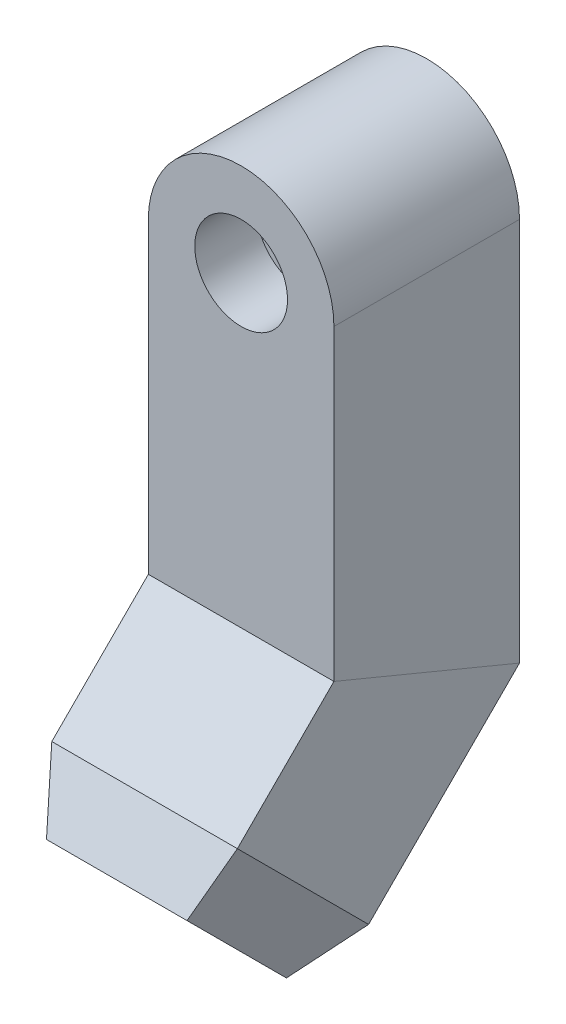
ISO-10303-21;
HEADER;
FILE_DESCRIPTION(('STEP AP214'),'2;1');
FILE_NAME('part.step','',(''),(''),'','','');
FILE_SCHEMA(('AUTOMOTIVE_DESIGN { 1 0 10303 214 1 1 1 1 }'));
ENDSEC;
DATA;
#1=APPLICATION_CONTEXT('core data for automotive mechanical design processes');
#2=APPLICATION_PROTOCOL_DEFINITION('international standard','automotive_design',2000,#1);
#3=PRODUCT_CONTEXT('',#1,'mechanical');
#4=PRODUCT('Part','Part','',(#3));
#5=PRODUCT_RELATED_PRODUCT_CATEGORY('part','',(#4));
#6=PRODUCT_DEFINITION_FORMATION('','',#4);
#7=PRODUCT_DEFINITION_CONTEXT('part definition',#1,'design');
#8=PRODUCT_DEFINITION('design','',#6,#7);
#9=PRODUCT_DEFINITION_SHAPE('','',#8);
#10=(LENGTH_UNIT() NAMED_UNIT(*) SI_UNIT(.MILLI.,.METRE.));
#11=(NAMED_UNIT(*) PLANE_ANGLE_UNIT() SI_UNIT($,.RADIAN.));
#12=(NAMED_UNIT(*) SI_UNIT($,.STERADIAN.) SOLID_ANGLE_UNIT());
#13=UNCERTAINTY_MEASURE_WITH_UNIT(LENGTH_MEASURE(1.E-05),#10,'distance_accuracy_value','');
#14=(GEOMETRIC_REPRESENTATION_CONTEXT(3) GLOBAL_UNCERTAINTY_ASSIGNED_CONTEXT((#13)) GLOBAL_UNIT_ASSIGNED_CONTEXT((#10,
#11,#12)) REPRESENTATION_CONTEXT('',''));
#15=CARTESIAN_POINT('',(0.,0.,0.));
#16=DIRECTION('',(0.,0.,1.));
#17=DIRECTION('',(1.,0.,0.));
#18=AXIS2_PLACEMENT_3D('',#15,#16,#17);
#19=CARTESIAN_POINT('',(19.05,45.0786722599583,7.26209610324912));
#20=DIRECTION('',(-1.,0.,0.));
#21=DIRECTION('',(0.,0.,1.));
#22=AXIS2_PLACEMENT_3D('',#19,#20,#21);
#23=PLANE('',#22);
#24=DIRECTION('',(0.,0.382683432365091,0.923879532511287));
#25=VECTOR('',#24,1.);
#26=CARTESIAN_POINT('',(19.05,42.5318762324136,41.3600079491902));
#27=LINE('',#26,#25);
#28=CARTESIAN_POINT('',(19.05,17.5092316367925,-19.05));
#29=VERTEX_POINT('',#28);
#30=CARTESIAN_POINT('',(19.05,33.2907683632075,19.05));
#31=VERTEX_POINT('',#30);
#32=EDGE_CURVE('E113',#29,#31,#27,.T.);
#33=ORIENTED_EDGE('',*,*,#32,.T.);
#34=DIRECTION('',(0.,-0.707106781186546,0.707106781186549));
#35=VECTOR('',#34,1.);
#36=CARTESIAN_POINT('',(19.05,45.0786722599583,7.26209610324912));
#37=LINE('',#36,#35);
#38=CARTESIAN_POINT('',(19.05,13.4703841816038,38.8703841816038));
#39=VERTEX_POINT('',#38);
#40=EDGE_CURVE('E49',#31,#39,#37,.T.);
#41=ORIENTED_EDGE('',*,*,#40,.T.);
#42=DIRECTION('',(0.,-0.707106781186549,-0.707106781186546));
#43=VECTOR('',#42,1.);
#44=CARTESIAN_POINT('',(19.05,13.4703841816038,38.8703841816038));
#45=LINE('',#44,#43);
#46=CARTESIAN_POINT('',(19.05,-13.4703841816038,11.9296158183964));
#47=VERTEX_POINT('',#46);
#48=EDGE_CURVE('E203',#39,#47,#45,.T.);
#49=ORIENTED_EDGE('',*,*,#48,.T.);
#50=DIRECTION('',(0.,-0.707106781186546,0.707106781186549));
#51=VECTOR('',#50,1.);
#52=CARTESIAN_POINT('',(19.05,18.1379038967508,-19.6786722599583));
#53=LINE('',#52,#51);
#54=EDGE_CURVE('E214',#29,#47,#53,.T.);
#55=ORIENTED_EDGE('',*,*,#54,.F.);
#56=EDGE_LOOP('',(#33,#41,#49,#55));
#57=FACE_BOUND('',#56,.T.);
#58=ADVANCED_FACE('F45',(#57),#23,.F.);
#59=CARTESIAN_POINT('',(-19.05,18.1379038967508,-19.6786722599583));
#60=DIRECTION('',(0.,0.707106781186549,0.707106781186546));
#61=DIRECTION('',(0.,-0.707106781186546,0.707106781186549));
#62=AXIS2_PLACEMENT_3D('',#59,#60,#61);
#63=PLANE('',#62);
#64=DIRECTION('',(1.,0.,0.));
#65=VECTOR('',#64,1.);
#66=CARTESIAN_POINT('',(-19.05,17.5092316367925,-19.05));
#67=LINE('',#66,#65);
#68=CARTESIAN_POINT('',(-19.05,17.5092316367925,-19.05));
#69=VERTEX_POINT('',#68);
#70=EDGE_CURVE('E11',#69,#29,#67,.T.);
#71=ORIENTED_EDGE('',*,*,#70,.T.);
#72=ORIENTED_EDGE('',*,*,#54,.T.);
#73=DIRECTION('',(-1.,0.,0.));
#74=VECTOR('',#73,1.);
#75=CARTESIAN_POINT('',(-19.05,-13.4703841816038,11.9296158183964));
#76=LINE('',#75,#74);
#77=CARTESIAN_POINT('',(-19.05,-13.4703841816038,11.9296158183964));
#78=VERTEX_POINT('',#77);
#79=EDGE_CURVE('E199',#47,#78,#76,.T.);
#80=ORIENTED_EDGE('',*,*,#79,.T.);
#81=DIRECTION('',(0.,-0.707106781186546,0.707106781186549));
#82=VECTOR('',#81,1.);
#83=CARTESIAN_POINT('',(-19.05,18.1379038967508,-19.6786722599583));
#84=LINE('',#83,#82);
#85=EDGE_CURVE('E211',#69,#78,#84,.T.);
#86=ORIENTED_EDGE('',*,*,#85,.F.);
#87=EDGE_LOOP('',(#71,#72,#80,#86));
#88=FACE_BOUND('',#87,.T.);
#89=ADVANCED_FACE('F236',(#88),#63,.F.);
#90=CARTESIAN_POINT('',(-19.05,45.0786722599583,7.26209610324912));
#91=DIRECTION('',(1.,0.,0.));
#92=DIRECTION('',(0.,0.,-1.));
#93=AXIS2_PLACEMENT_3D('',#90,#91,#92);
#94=PLANE('',#93);
#95=DIRECTION('',(0.,-0.382683432365091,-0.923879532511287));
#96=VECTOR('',#95,1.);
#97=CARTESIAN_POINT('',(-19.05,42.5318762324136,41.3600079491902));
#98=LINE('',#97,#96);
#99=CARTESIAN_POINT('',(-19.05,33.2907683632075,19.05));
#100=VERTEX_POINT('',#99);
#101=EDGE_CURVE('E56',#100,#69,#98,.T.);
#102=ORIENTED_EDGE('',*,*,#101,.T.);
#103=ORIENTED_EDGE('',*,*,#85,.T.);
#104=DIRECTION('',(0.,0.707106781186549,0.707106781186546));
#105=VECTOR('',#104,1.);
#106=CARTESIAN_POINT('',(-19.05,13.4703841816038,38.8703841816038));
#107=LINE('',#106,#105);
#108=CARTESIAN_POINT('',(-19.05,13.4703841816038,38.8703841816038));
#109=VERTEX_POINT('',#108);
#110=EDGE_CURVE('E195',#78,#109,#107,.T.);
#111=ORIENTED_EDGE('',*,*,#110,.T.);
#112=DIRECTION('',(0.,-0.707106781186546,0.707106781186549));
#113=VECTOR('',#112,1.);
#114=CARTESIAN_POINT('',(-19.05,45.0786722599583,7.26209610324912));
#115=LINE('',#114,#113);
#116=EDGE_CURVE('E207',#100,#109,#115,.T.);
#117=ORIENTED_EDGE('',*,*,#116,.F.);
#118=EDGE_LOOP('',(#102,#103,#111,#117));
#119=FACE_BOUND('',#118,.T.);
#120=ADVANCED_FACE('F235',(#119),#94,.F.);
#121=CARTESIAN_POINT('',(-19.05,45.0786722599583,7.26209610324912));
#122=DIRECTION('',(0.,-0.707106781186549,-0.707106781186546));
#123=DIRECTION('',(0.,0.707106781186546,-0.707106781186549));
#124=AXIS2_PLACEMENT_3D('',#121,#122,#123);
#125=PLANE('',#124);
#126=DIRECTION('',(-1.,0.,0.));
#127=VECTOR('',#126,1.);
#128=CARTESIAN_POINT('',(-19.05,33.2907683632075,19.05));
#129=LINE('',#128,#127);
#130=EDGE_CURVE('E176',#31,#100,#129,.T.);
#131=ORIENTED_EDGE('',*,*,#130,.T.);
#132=ORIENTED_EDGE('',*,*,#116,.T.);
#133=DIRECTION('',(1.,0.,0.));
#134=VECTOR('',#133,1.);
#135=CARTESIAN_POINT('',(-19.05,13.4703841816038,38.8703841816038));
#136=LINE('',#135,#134);
#137=EDGE_CURVE('E148',#109,#39,#136,.T.);
#138=ORIENTED_EDGE('',*,*,#137,.T.);
#139=ORIENTED_EDGE('',*,*,#40,.F.);
#140=EDGE_LOOP('',(#131,#132,#138,#139));
#141=FACE_BOUND('',#140,.T.);
#142=ADVANCED_FACE('F47',(#141),#125,.F.);
#143=CARTESIAN_POINT('',(-19.05,96.393,19.05));
#144=DIRECTION('',(0.,0.,-1.));
#145=DIRECTION('',(0.,1.,0.));
#146=AXIS2_PLACEMENT_3D('',#143,#144,#145);
#147=PLANE('',#146);
#148=CARTESIAN_POINT('',(0.,96.393,19.05));
#149=DIRECTION('',(0.,0.,1.));
#150=DIRECTION('',(1.,0.,0.));
#151=AXIS2_PLACEMENT_3D('',#148,#149,#150);
#152=CIRCLE('',#151,9.525);
#153=CARTESIAN_POINT('',(9.525,96.393,19.05));
#154=VERTEX_POINT('',#153);
#155=EDGE_CURVE('E141',#154,#154,#152,.T.);
#156=ORIENTED_EDGE('',*,*,#155,.F.);
#157=EDGE_LOOP('',(#156));
#158=FACE_BOUND('',#157,.T.);
#159=DIRECTION('',(0.,-1.,0.));
#160=VECTOR('',#159,1.);
#161=CARTESIAN_POINT('',(19.05,96.393,19.05));
#162=LINE('',#161,#160);
#163=CARTESIAN_POINT('',(19.05,96.393,19.05));
#164=VERTEX_POINT('',#163);
#165=EDGE_CURVE('E118',#164,#31,#162,.T.);
#166=ORIENTED_EDGE('',*,*,#165,.F.);
#167=CARTESIAN_POINT('',(0.,96.393,19.05));
#168=DIRECTION('',(0.,0.,-1.));
#169=DIRECTION('',(0.,1.,0.));
#170=AXIS2_PLACEMENT_3D('',#167,#168,#169);
#171=CIRCLE('',#170,19.05);
#172=CARTESIAN_POINT('',(-19.05,96.393,19.05));
#173=VERTEX_POINT('',#172);
#174=EDGE_CURVE('E127',#164,#173,#171,.F.);
#175=ORIENTED_EDGE('',*,*,#174,.T.);
#176=DIRECTION('',(0.,-1.,0.));
#177=VECTOR('',#176,1.);
#178=CARTESIAN_POINT('',(-19.05,96.393,19.05));
#179=LINE('',#178,#177);
#180=EDGE_CURVE('E184',#173,#100,#179,.T.);
#181=ORIENTED_EDGE('',*,*,#180,.T.);
#182=ORIENTED_EDGE('',*,*,#130,.F.);
#183=EDGE_LOOP('',(#166,#175,#181,#182));
#184=FACE_BOUND('',#183,.T.);
#185=ADVANCED_FACE('F265',(#158,#184),#147,.F.);
#186=CARTESIAN_POINT('',(-19.05,96.393,19.05));
#187=DIRECTION('',(1.,0.,0.));
#188=DIRECTION('',(0.,0.,-1.));
#189=AXIS2_PLACEMENT_3D('',#186,#187,#188);
#190=PLANE('',#189);
#191=ORIENTED_EDGE('',*,*,#180,.F.);
#192=DIRECTION('',(0.,0.,1.));
#193=VECTOR('',#192,1.);
#194=CARTESIAN_POINT('',(-19.05,96.393,19.05));
#195=LINE('',#194,#193);
#196=CARTESIAN_POINT('',(-19.05,96.393,-19.05));
#197=VERTEX_POINT('',#196);
#198=EDGE_CURVE('E129',#197,#173,#195,.T.);
#199=ORIENTED_EDGE('',*,*,#198,.F.);
#200=DIRECTION('',(0.,-1.,0.));
#201=VECTOR('',#200,1.);
#202=CARTESIAN_POINT('',(-19.05,96.393,-19.05));
#203=LINE('',#202,#201);
#204=EDGE_CURVE('E117',#197,#69,#203,.T.);
#205=ORIENTED_EDGE('',*,*,#204,.T.);
#206=ORIENTED_EDGE('',*,*,#101,.F.);
#207=EDGE_LOOP('',(#191,#199,#205,#206));
#208=FACE_BOUND('',#207,.T.);
#209=ADVANCED_FACE('F260',(#208),#190,.F.);
#210=CARTESIAN_POINT('',(-19.05,96.393,-19.05));
#211=DIRECTION('',(0.,0.,1.));
#212=DIRECTION('',(0.,-1.,0.));
#213=AXIS2_PLACEMENT_3D('',#210,#211,#212);
#214=PLANE('',#213);
#215=ORIENTED_EDGE('',*,*,#204,.F.);
#216=CARTESIAN_POINT('',(0.,96.393,-19.05));
#217=DIRECTION('',(0.,0.,-1.));
#218=DIRECTION('',(0.,1.,0.));
#219=AXIS2_PLACEMENT_3D('',#216,#217,#218);
#220=CIRCLE('',#219,19.05);
#221=CARTESIAN_POINT('',(19.05,96.393,-19.05));
#222=VERTEX_POINT('',#221);
#223=EDGE_CURVE('E125',#197,#222,#220,.T.);
#224=ORIENTED_EDGE('',*,*,#223,.T.);
#225=DIRECTION('',(0.,-1.,0.));
#226=VECTOR('',#225,1.);
#227=CARTESIAN_POINT('',(19.05,96.393,-19.05));
#228=LINE('',#227,#226);
#229=EDGE_CURVE('E106',#222,#29,#228,.T.);
#230=ORIENTED_EDGE('',*,*,#229,.T.);
#231=ORIENTED_EDGE('',*,*,#70,.F.);
#232=EDGE_LOOP('',(#215,#224,#230,#231));
#233=FACE_BOUND('',#232,.T.);
#234=ADVANCED_FACE('F131',(#233),#214,.F.);
#235=CARTESIAN_POINT('',(19.05,96.393,19.05));
#236=DIRECTION('',(-1.,0.,0.));
#237=DIRECTION('',(0.,0.,1.));
#238=AXIS2_PLACEMENT_3D('',#235,#236,#237);
#239=PLANE('',#238);
#240=ORIENTED_EDGE('',*,*,#229,.F.);
#241=DIRECTION('',(0.,0.,-1.));
#242=VECTOR('',#241,1.);
#243=CARTESIAN_POINT('',(19.05,96.393,19.05));
#244=LINE('',#243,#242);
#245=EDGE_CURVE('E110',#164,#222,#244,.T.);
#246=ORIENTED_EDGE('',*,*,#245,.F.);
#247=ORIENTED_EDGE('',*,*,#165,.T.);
#248=ORIENTED_EDGE('',*,*,#32,.F.);
#249=EDGE_LOOP('',(#240,#246,#247,#248));
#250=FACE_BOUND('',#249,.T.);
#251=ADVANCED_FACE('F108',(#250),#239,.F.);
#252=CARTESIAN_POINT('',(-19.05,-13.4703841816038,11.9296158183964));
#253=DIRECTION('',(0.,-0.906307787036651,-0.422618261740697));
#254=DIRECTION('',(0.,0.422618261740697,-0.906307787036651));
#255=AXIS2_PLACEMENT_3D('',#252,#253,#254);
#256=PLANE('',#255);
#257=ORIENTED_EDGE('',*,*,#79,.F.);
#258=DIRECTION('',(0.323615577118185,0.399876601840004,-0.857538139995741));
#259=VECTOR('',#258,1.);
#260=CARTESIAN_POINT('',(19.05,-13.4703841816038,11.9296158183964));
#261=LINE('',#260,#259);
#262=CARTESIAN_POINT('',(14.4275780248192,-19.1820943785168,24.1784178636216));
#263=VERTEX_POINT('',#262);
#264=EDGE_CURVE('E145',#263,#47,#261,.T.);
#265=ORIENTED_EDGE('',*,*,#264,.F.);
#266=DIRECTION('',(-1.,0.,0.));
#267=VECTOR('',#266,1.);
#268=CARTESIAN_POINT('',(-19.05,-19.1820943785168,24.1784178636216));
#269=LINE('',#268,#267);
#270=CARTESIAN_POINT('',(-14.4275780248192,-19.1820943785168,24.1784178636216));
#271=VERTEX_POINT('',#270);
#272=EDGE_CURVE('E138',#271,#263,#269,.F.);
#273=ORIENTED_EDGE('',*,*,#272,.F.);
#274=DIRECTION('',(-0.323615577118185,0.399876601840004,-0.857538139995741));
#275=VECTOR('',#274,1.);
#276=CARTESIAN_POINT('',(-19.05,-13.4703841816038,11.9296158183964));
#277=LINE('',#276,#275);
#278=EDGE_CURVE('E150',#271,#78,#277,.T.);
#279=ORIENTED_EDGE('',*,*,#278,.T.);
#280=EDGE_LOOP('',(#257,#265,#273,#279));
#281=FACE_BOUND('',#280,.T.);
#282=ADVANCED_FACE('F240',(#281),#256,.T.);
#283=CARTESIAN_POINT('',(19.05,-13.4703841816038,11.9296158183964));
#284=DIRECTION('',(0.939692620785908,-0.241844762647975,0.241844762647976));
#285=DIRECTION('',(0.249243569363955,0.,-0.968440830991091));
#286=AXIS2_PLACEMENT_3D('',#283,#284,#285);
#287=PLANE('',#286);
#288=ORIENTED_EDGE('',*,*,#48,.F.);
#289=DIRECTION('',(0.323615577118185,0.857538139995739,-0.399876601840008));
#290=VECTOR('',#289,1.);
#291=CARTESIAN_POINT('',(19.05,13.4703841816038,38.8703841816038));
#292=LINE('',#291,#290);
#293=CARTESIAN_POINT('',(14.4275780248192,1.22158213637858,44.5820943785169));
#294=VERTEX_POINT('',#293);
#295=EDGE_CURVE('E149',#294,#39,#292,.T.);
#296=ORIENTED_EDGE('',*,*,#295,.F.);
#297=DIRECTION('',(0.,-0.707106781186549,-0.707106781186546));
#298=VECTOR('',#297,1.);
#299=CARTESIAN_POINT('',(14.4275780248192,-22.4506403026729,20.9098719394655));
#300=LINE('',#299,#298);
#301=EDGE_CURVE('E165',#263,#294,#300,.F.);
#302=ORIENTED_EDGE('',*,*,#301,.F.);
#303=ORIENTED_EDGE('',*,*,#264,.T.);
#304=EDGE_LOOP('',(#288,#296,#302,#303));
#305=FACE_BOUND('',#304,.T.);
#306=ADVANCED_FACE('F245',(#305),#287,.T.);
#307=CARTESIAN_POINT('',(19.05,13.4703841816038,38.8703841816038));
#308=DIRECTION('',(0.,0.4226182617407,0.906307787036649));
#309=DIRECTION('',(0.,-0.90630778703665,0.4226182617407));
#310=AXIS2_PLACEMENT_3D('',#307,#308,#309);
#311=PLANE('',#310);
#312=ORIENTED_EDGE('',*,*,#137,.F.);
#313=DIRECTION('',(-0.323615577118185,0.857538139995739,-0.399876601840008));
#314=VECTOR('',#313,1.);
#315=CARTESIAN_POINT('',(-19.05,13.4703841816038,38.8703841816038));
#316=LINE('',#315,#314);
#317=CARTESIAN_POINT('',(-14.4275780248192,1.22158213637858,44.5820943785169));
#318=VERTEX_POINT('',#317);
#319=EDGE_CURVE('E154',#318,#109,#316,.T.);
#320=ORIENTED_EDGE('',*,*,#319,.F.);
#321=DIRECTION('',(1.,0.,0.));
#322=VECTOR('',#321,1.);
#323=CARTESIAN_POINT('',(19.05,1.22158213637857,44.5820943785169));
#324=LINE('',#323,#322);
#325=EDGE_CURVE('E168',#294,#318,#324,.F.);
#326=ORIENTED_EDGE('',*,*,#325,.F.);
#327=ORIENTED_EDGE('',*,*,#295,.T.);
#328=EDGE_LOOP('',(#312,#320,#326,#327));
#329=FACE_BOUND('',#328,.T.);
#330=ADVANCED_FACE('F227',(#329),#311,.T.);
#331=CARTESIAN_POINT('',(-19.05,13.4703841816038,38.8703841816038));
#332=DIRECTION('',(-0.939692620785908,-0.241844762647975,0.241844762647976));
#333=DIRECTION('',(0.249243569363955,0.,0.968440830991091));
#334=AXIS2_PLACEMENT_3D('',#331,#332,#333);
#335=PLANE('',#334);
#336=ORIENTED_EDGE('',*,*,#110,.F.);
#337=ORIENTED_EDGE('',*,*,#278,.F.);
#338=DIRECTION('',(0.,0.707106781186549,0.707106781186546));
#339=VECTOR('',#338,1.);
#340=CARTESIAN_POINT('',(-14.4275780248192,4.49012806053463,47.850640302673));
#341=LINE('',#340,#339);
#342=EDGE_CURVE('E155',#318,#271,#341,.F.);
#343=ORIENTED_EDGE('',*,*,#342,.F.);
#344=ORIENTED_EDGE('',*,*,#319,.T.);
#345=EDGE_LOOP('',(#336,#337,#343,#344));
#346=FACE_BOUND('',#345,.T.);
#347=ADVANCED_FACE('F232',(#346),#335,.T.);
#348=CARTESIAN_POINT('',(0.,-21.6802561210692,21.6802561210693));
#349=DIRECTION('',(0.,-0.707106781186546,0.707106781186549));
#350=DIRECTION('',(0.,-0.707106781186549,-0.707106781186546));
#351=AXIS2_PLACEMENT_3D('',#348,#349,#350);
#352=PLANE('',#351);
#353=CARTESIAN_POINT('',(0.,-8.98025612106913,34.3802561210692));
#354=DIRECTION('',(0.,-0.707106781186546,0.707106781186549));
#355=DIRECTION('',(0.,-0.707106781186549,-0.707106781186546));
#356=AXIS2_PLACEMENT_3D('',#353,#354,#355);
#357=CIRCLE('',#356,9.525);
#358=CARTESIAN_POINT('',(0.,-15.715448211871,27.6450640302674));
#359=VERTEX_POINT('',#358);
#360=EDGE_CURVE('E386',#359,#359,#357,.T.);
#361=ORIENTED_EDGE('',*,*,#360,.F.);
#362=EDGE_LOOP('',(#361));
#363=FACE_BOUND('',#362,.T.);
#364=ORIENTED_EDGE('',*,*,#272,.T.);
#365=ORIENTED_EDGE('',*,*,#301,.T.);
#366=ORIENTED_EDGE('',*,*,#325,.T.);
#367=ORIENTED_EDGE('',*,*,#342,.T.);
#368=EDGE_LOOP('',(#364,#365,#366,#367));
#369=FACE_BOUND('',#368,.T.);
#370=ADVANCED_FACE('F243',(#363,#369),#352,.T.);
#371=CARTESIAN_POINT('',(0.,96.393,61.647094971371));
#372=DIRECTION('',(0.,0.,-1.));
#373=DIRECTION('',(0.,1.,0.));
#374=AXIS2_PLACEMENT_3D('',#371,#372,#373);
#375=CYLINDRICAL_SURFACE('',#374,19.05);
#376=ORIENTED_EDGE('',*,*,#174,.F.);
#377=ORIENTED_EDGE('',*,*,#245,.T.);
#378=ORIENTED_EDGE('',*,*,#223,.F.);
#379=ORIENTED_EDGE('',*,*,#198,.T.);
#380=EDGE_LOOP('',(#376,#377,#378,#379));
#381=FACE_BOUND('',#380,.T.);
#382=ADVANCED_FACE('F123',(#381),#375,.T.);
#383=CARTESIAN_POINT('',(0.,96.393,6.34999999999999));
#384=DIRECTION('',(0.,0.,1.));
#385=DIRECTION('',(1.,0.,0.));
#386=AXIS2_PLACEMENT_3D('',#383,#384,#385);
#387=CYLINDRICAL_SURFACE('',#386,9.525);
#388=CARTESIAN_POINT('',(0.,96.393,6.34999999999999));
#389=DIRECTION('',(0.,0.,1.));
#390=DIRECTION('',(1.,0.,0.));
#391=AXIS2_PLACEMENT_3D('',#388,#389,#390);
#392=CIRCLE('',#391,9.525);
#393=CARTESIAN_POINT('',(9.525,96.393,6.34999999999999));
#394=VERTEX_POINT('',#393);
#395=EDGE_CURVE('E134',#394,#394,#392,.T.);
#396=ORIENTED_EDGE('',*,*,#395,.F.);
#397=EDGE_LOOP('',(#396));
#398=FACE_BOUND('',#397,.T.);
#399=ORIENTED_EDGE('',*,*,#155,.T.);
#400=EDGE_LOOP('',(#399));
#401=FACE_BOUND('',#400,.T.);
#402=ADVANCED_FACE('F343',(#398,#401),#387,.F.);
#403=CARTESIAN_POINT('',(0.,96.393,6.34999999999999));
#404=DIRECTION('',(0.,0.,1.));
#405=DIRECTION('',(1.,0.,0.));
#406=AXIS2_PLACEMENT_3D('',#403,#404,#405);
#407=PLANE('',#406);
#408=ORIENTED_EDGE('',*,*,#395,.T.);
#409=EDGE_LOOP('',(#408));
#410=FACE_BOUND('',#409,.T.);
#411=ADVANCED_FACE('F351',(#410),#407,.T.);
#412=CARTESIAN_POINT('',(0.,0.,25.4000000000001));
#413=DIRECTION('',(0.,-0.707106781186546,0.707106781186549));
#414=DIRECTION('',(0.,-0.707106781186549,-0.707106781186546));
#415=AXIS2_PLACEMENT_3D('',#412,#413,#414);
#416=CYLINDRICAL_SURFACE('',#415,9.525);
#417=CARTESIAN_POINT('',(0.,0.,25.4000000000001));
#418=DIRECTION('',(0.,-0.707106781186546,0.707106781186549));
#419=DIRECTION('',(0.,-0.707106781186549,-0.707106781186546));
#420=AXIS2_PLACEMENT_3D('',#417,#418,#419);
#421=CIRCLE('',#420,9.525);
#422=CARTESIAN_POINT('',(0.,-6.73519209080187,18.6648079091982));
#423=VERTEX_POINT('',#422);
#424=EDGE_CURVE('E384',#423,#423,#421,.T.);
#425=ORIENTED_EDGE('',*,*,#424,.F.);
#426=EDGE_LOOP('',(#425));
#427=FACE_BOUND('',#426,.T.);
#428=ORIENTED_EDGE('',*,*,#360,.T.);
#429=EDGE_LOOP('',(#428));
#430=FACE_BOUND('',#429,.T.);
#431=ADVANCED_FACE('F360',(#427,#430),#416,.F.);
#432=CARTESIAN_POINT('',(0.,0.,25.4000000000001));
#433=DIRECTION('',(0.,-0.707106781186546,0.707106781186549));
#434=DIRECTION('',(0.,-0.707106781186549,-0.707106781186546));
#435=AXIS2_PLACEMENT_3D('',#432,#433,#434);
#436=PLANE('',#435);
#437=ORIENTED_EDGE('',*,*,#424,.T.);
#438=EDGE_LOOP('',(#437));
#439=FACE_BOUND('',#438,.T.);
#440=ADVANCED_FACE('F369',(#439),#436,.T.);
#441=CLOSED_SHELL('',(#58,#89,#120,#142,#185,#209,#234,#251,#282,#306,#330,#347,#370,#382,#402,
#411,#431,#440));
#442=MANIFOLD_SOLID_BREP('B2',#441);
#443=ADVANCED_BREP_SHAPE_REPRESENTATION('',(#18,#442),#14);
#444=SHAPE_DEFINITION_REPRESENTATION(#9,#443);
ENDSEC;
END-ISO-10303-21;
